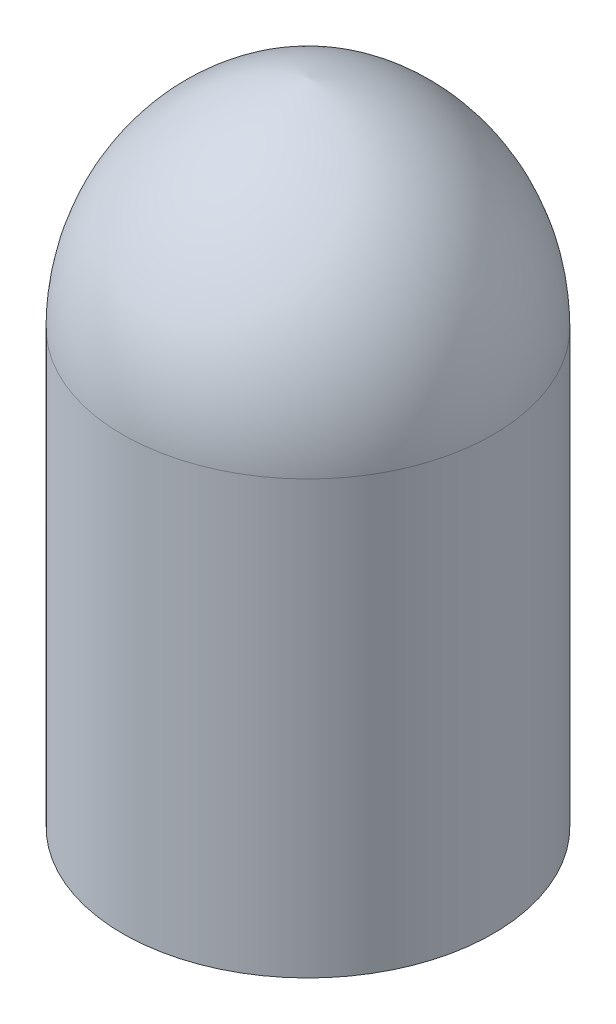
ISO-10303-21;
HEADER;
FILE_DESCRIPTION(('STEP AP214'),'2;1');
FILE_NAME('part.step','',(''),(''),'','','');
FILE_SCHEMA(('AUTOMOTIVE_DESIGN { 1 0 10303 214 1 1 1 1 }'));
ENDSEC;
DATA;
#1=APPLICATION_CONTEXT('core data for automotive mechanical design processes');
#2=APPLICATION_PROTOCOL_DEFINITION('international standard','automotive_design',2000,#1);
#3=PRODUCT_CONTEXT('',#1,'mechanical');
#4=PRODUCT('Part','Part','',(#3));
#5=PRODUCT_RELATED_PRODUCT_CATEGORY('part','',(#4));
#6=PRODUCT_DEFINITION_FORMATION('','',#4);
#7=PRODUCT_DEFINITION_CONTEXT('part definition',#1,'design');
#8=PRODUCT_DEFINITION('design','',#6,#7);
#9=PRODUCT_DEFINITION_SHAPE('','',#8);
#10=(LENGTH_UNIT() NAMED_UNIT(*) SI_UNIT(.MILLI.,.METRE.));
#11=(NAMED_UNIT(*) PLANE_ANGLE_UNIT() SI_UNIT($,.RADIAN.));
#12=(NAMED_UNIT(*) SI_UNIT($,.STERADIAN.) SOLID_ANGLE_UNIT());
#13=UNCERTAINTY_MEASURE_WITH_UNIT(LENGTH_MEASURE(1.E-05),#10,'distance_accuracy_value','');
#14=(GEOMETRIC_REPRESENTATION_CONTEXT(3) GLOBAL_UNCERTAINTY_ASSIGNED_CONTEXT((#13)) GLOBAL_UNIT_ASSIGNED_CONTEXT((#10,
#11,#12)) REPRESENTATION_CONTEXT('',''));
#15=CARTESIAN_POINT('',(0.,0.,0.));
#16=DIRECTION('',(0.,0.,1.));
#17=DIRECTION('',(1.,0.,0.));
#18=AXIS2_PLACEMENT_3D('',#15,#16,#17);
#19=CARTESIAN_POINT('',(0.,0.,0.));
#20=DIRECTION('',(0.,1.,0.));
#21=DIRECTION('',(-1.,0.,0.));
#22=AXIS2_PLACEMENT_3D('',#19,#20,#21);
#23=PLANE('',#22);
#24=CARTESIAN_POINT('',(0.,0.,0.));
#25=DIRECTION('',(0.,1.,0.));
#26=DIRECTION('',(-1.,0.,0.));
#27=AXIS2_PLACEMENT_3D('',#24,#25,#26);
#28=CIRCLE('',#27,58.);
#29=CARTESIAN_POINT('',(-58.,0.,0.));
#30=VERTEX_POINT('',#29);
#31=EDGE_CURVE('E57',#30,#30,#28,.T.);
#32=ORIENTED_EDGE('',*,*,#31,.T.);
#33=EDGE_LOOP('',(#32));
#34=FACE_BOUND('',#33,.T.);
#35=CARTESIAN_POINT('',(0.,0.,0.));
#36=DIRECTION('',(0.,1.,0.));
#37=DIRECTION('',(-1.,0.,0.));
#38=AXIS2_PLACEMENT_3D('',#35,#36,#37);
#39=CIRCLE('',#38,60.);
#40=CARTESIAN_POINT('',(-60.,0.,0.));
#41=VERTEX_POINT('',#40);
#42=EDGE_CURVE('E11',#41,#41,#39,.T.);
#43=ORIENTED_EDGE('',*,*,#42,.F.);
#44=EDGE_LOOP('',(#43));
#45=FACE_BOUND('',#44,.T.);
#46=ADVANCED_FACE('F35',(#34,#45),#23,.F.);
#47=CARTESIAN_POINT('',(0.,210.,0.));
#48=DIRECTION('',(0.,1.,0.));
#49=DIRECTION('',(-1.,0.,0.));
#50=AXIS2_PLACEMENT_3D('',#47,#48,#49);
#51=CYLINDRICAL_SURFACE('',#50,60.);
#52=CARTESIAN_POINT('',(0.,140.,0.));
#53=DIRECTION('',(0.,1.,0.));
#54=DIRECTION('',(-1.,0.,0.));
#55=AXIS2_PLACEMENT_3D('',#52,#53,#54);
#56=CIRCLE('',#55,60.);
#57=CARTESIAN_POINT('',(-60.,140.,0.));
#58=VERTEX_POINT('',#57);
#59=EDGE_CURVE('E42',#58,#58,#56,.T.);
#60=ORIENTED_EDGE('',*,*,#59,.F.);
#61=EDGE_LOOP('',(#60));
#62=FACE_BOUND('',#61,.T.);
#63=ORIENTED_EDGE('',*,*,#42,.T.);
#64=EDGE_LOOP('',(#63));
#65=FACE_BOUND('',#64,.T.);
#66=ADVANCED_FACE('F66',(#62,#65),#51,.T.);
#67=CARTESIAN_POINT('',(10.8333333333333,140.,0.));
#68=DIRECTION('',(0.,0.,-1.));
#69=DIRECTION('',(-1.,0.,0.));
#70=AXIS2_PLACEMENT_3D('',#67,#68,#69);
#71=CIRCLE('',#70,70.8333333333333);
#72=TRIMMED_CURVE('',#71,(PARAMETER_VALUE(-1.41725254425534)),
(PARAMETER_VALUE(1.41725254425534)),.T.,.PARAMETER.);
#73=CARTESIAN_POINT('',(0.,140.,0.));
#74=DIRECTION('',(0.,1.,0.));
#75=AXIS1_PLACEMENT('',#73,#74);
#76=SURFACE_OF_REVOLUTION('',#72,#75);
#77=CARTESIAN_POINT('',(0.,210.,0.));
#78=VERTEX_POINT('',#77);
#79=VERTEX_LOOP('',#78);
#80=FACE_BOUND('',#79,.T.);
#81=ORIENTED_EDGE('',*,*,#59,.T.);
#82=EDGE_LOOP('',(#81));
#83=FACE_BOUND('',#82,.T.);
#84=ADVANCED_FACE('F64',(#80,#83),#76,.T.);
#85=CARTESIAN_POINT('',(0.,210.,0.));
#86=DIRECTION('',(0.,1.,0.));
#87=DIRECTION('',(-1.,0.,0.));
#88=AXIS2_PLACEMENT_3D('',#85,#86,#87);
#89=CYLINDRICAL_SURFACE('',#88,58.);
#90=CARTESIAN_POINT('',(0.,140.,0.));
#91=DIRECTION('',(0.,1.,0.));
#92=DIRECTION('',(-1.,0.,0.));
#93=AXIS2_PLACEMENT_3D('',#90,#91,#92);
#94=CIRCLE('',#93,58.);
#95=CARTESIAN_POINT('',(-58.,140.,0.));
#96=VERTEX_POINT('',#95);
#97=EDGE_CURVE('E55',#96,#96,#94,.T.);
#98=ORIENTED_EDGE('',*,*,#97,.T.);
#99=EDGE_LOOP('',(#98));
#100=FACE_BOUND('',#99,.T.);
#101=ORIENTED_EDGE('',*,*,#31,.F.);
#102=EDGE_LOOP('',(#101));
#103=FACE_BOUND('',#102,.T.);
#104=ADVANCED_FACE('F51',(#100,#103),#89,.F.);
#105=CARTESIAN_POINT('',(10.8333333333333,140.,0.));
#106=DIRECTION('',(0.,0.,-1.));
#107=DIRECTION('',(-1.,0.,0.));
#108=AXIS2_PLACEMENT_3D('',#105,#106,#107);
#109=CIRCLE('',#108,68.8333333333333);
#110=TRIMMED_CURVE('',#109,(PARAMETER_VALUE(-1.41275424937092)),
(PARAMETER_VALUE(1.41275424937092)),.T.,.PARAMETER.);
#111=CARTESIAN_POINT('',(0.,140.,0.));
#112=DIRECTION('',(0.,1.,0.));
#113=AXIS1_PLACEMENT('',#111,#112);
#114=SURFACE_OF_REVOLUTION('',#110,#113);
#115=CARTESIAN_POINT('',(0.,207.97548577735,0.));
#116=VERTEX_POINT('',#115);
#117=VERTEX_LOOP('',#116);
#118=FACE_BOUND('',#117,.T.);
#119=ORIENTED_EDGE('',*,*,#97,.F.);
#120=EDGE_LOOP('',(#119));
#121=FACE_BOUND('',#120,.T.);
#122=ADVANCED_FACE('F48',(#118,#121),#114,.F.);
#123=CLOSED_SHELL('',(#46,#66,#84,#104,#122));
#124=MANIFOLD_SOLID_BREP('B2',#123);
#125=ADVANCED_BREP_SHAPE_REPRESENTATION('',(#18,#124),#14);
#126=SHAPE_DEFINITION_REPRESENTATION(#9,#125);
ENDSEC;
END-ISO-10303-21;
